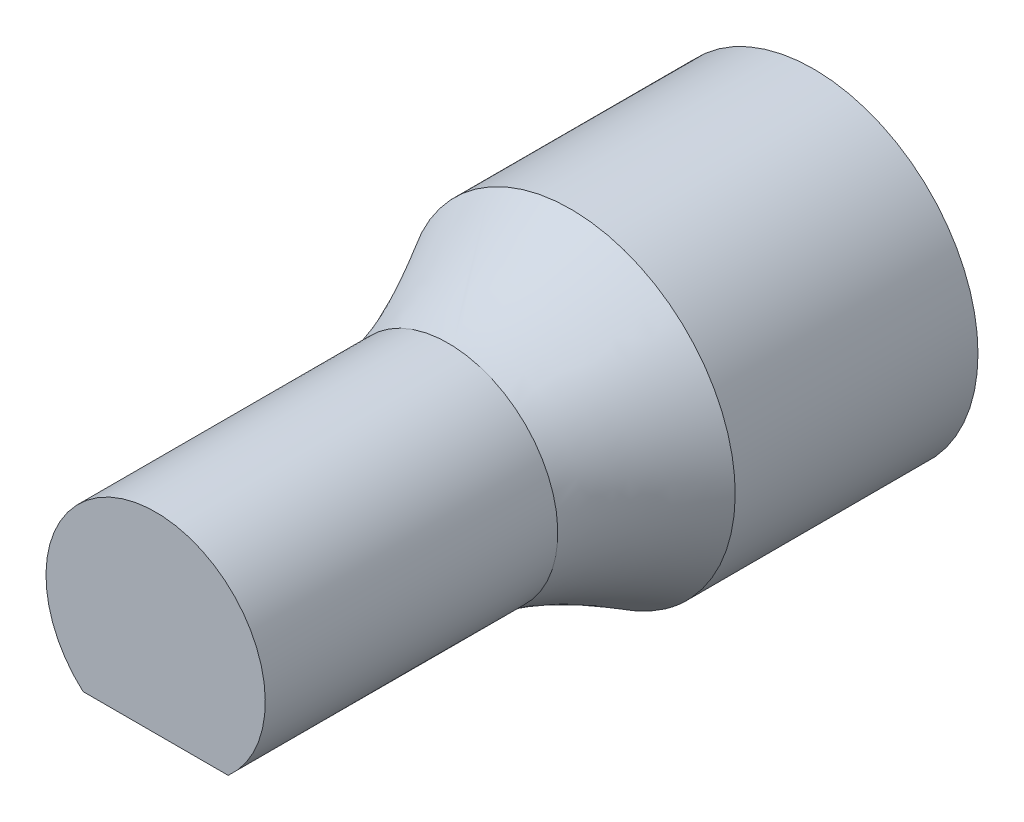
ISO-10303-21;
HEADER;
FILE_DESCRIPTION(('STEP AP214'),'2;1');
FILE_NAME('part.step','',(''),(''),'','','');
FILE_SCHEMA(('AUTOMOTIVE_DESIGN { 1 0 10303 214 1 1 1 1 }'));
ENDSEC;
DATA;
#1=APPLICATION_CONTEXT('core data for automotive mechanical design processes');
#2=APPLICATION_PROTOCOL_DEFINITION('international standard','automotive_design',2000,#1);
#3=PRODUCT_CONTEXT('',#1,'mechanical');
#4=PRODUCT('Part','Part','',(#3));
#5=PRODUCT_RELATED_PRODUCT_CATEGORY('part','',(#4));
#6=PRODUCT_DEFINITION_FORMATION('','',#4);
#7=PRODUCT_DEFINITION_CONTEXT('part definition',#1,'design');
#8=PRODUCT_DEFINITION('design','',#6,#7);
#9=PRODUCT_DEFINITION_SHAPE('','',#8);
#10=(LENGTH_UNIT() NAMED_UNIT(*) SI_UNIT(.MILLI.,.METRE.));
#11=(NAMED_UNIT(*) PLANE_ANGLE_UNIT() SI_UNIT($,.RADIAN.));
#12=(NAMED_UNIT(*) SI_UNIT($,.STERADIAN.) SOLID_ANGLE_UNIT());
#13=UNCERTAINTY_MEASURE_WITH_UNIT(LENGTH_MEASURE(1.E-05),#10,'distance_accuracy_value','');
#14=(GEOMETRIC_REPRESENTATION_CONTEXT(3) GLOBAL_UNCERTAINTY_ASSIGNED_CONTEXT((#13)) GLOBAL_UNIT_ASSIGNED_CONTEXT((#10,
#11,#12)) REPRESENTATION_CONTEXT('',''));
#15=CARTESIAN_POINT('',(0.,0.,0.));
#16=DIRECTION('',(0.,0.,1.));
#17=DIRECTION('',(1.,0.,0.));
#18=AXIS2_PLACEMENT_3D('',#15,#16,#17);
#19=CARTESIAN_POINT('',(0.,-0.79,14.06));
#20=DIRECTION('',(0.,0.,-1.));
#21=DIRECTION('',(-1.,0.,0.));
#22=AXIS2_PLACEMENT_3D('',#19,#20,#21);
#23=CYLINDRICAL_SURFACE('',#22,5.555);
#24=CARTESIAN_POINT('',(0.,-0.79,14.06));
#25=DIRECTION('',(0.,0.,1.));
#26=DIRECTION('',(1.,0.,0.));
#27=AXIS2_PLACEMENT_3D('',#24,#25,#26);
#28=CIRCLE('',#27,5.555);
#29=CARTESIAN_POINT('',(3.88550189808215,-4.76,14.06));
#30=VERTEX_POINT('',#29);
#31=CARTESIAN_POINT('',(-3.88550189808215,-4.76,14.06));
#32=VERTEX_POINT('',#31);
#33=EDGE_CURVE('E86',#30,#32,#28,.T.);
#34=ORIENTED_EDGE('',*,*,#33,.T.);
#35=DIRECTION('',(0.,0.,-1.));
#36=VECTOR('',#35,1.);
#37=CARTESIAN_POINT('',(-3.88550189808215,-4.76,38.102));
#38=LINE('',#37,#36);
#39=CARTESIAN_POINT('',(-3.88550189808215,-4.76,0.));
#40=VERTEX_POINT('',#39);
#41=EDGE_CURVE('E67',#32,#40,#38,.T.);
#42=ORIENTED_EDGE('',*,*,#41,.T.);
#43=CARTESIAN_POINT('',(0.,-0.79,0.));
#44=DIRECTION('',(0.,0.,1.));
#45=DIRECTION('',(1.,0.,0.));
#46=AXIS2_PLACEMENT_3D('',#43,#44,#45);
#47=CIRCLE('',#46,5.555);
#48=CARTESIAN_POINT('',(3.88550189808215,-4.76,0.));
#49=VERTEX_POINT('',#48);
#50=EDGE_CURVE('E62',#49,#40,#47,.T.);
#51=ORIENTED_EDGE('',*,*,#50,.F.);
#52=DIRECTION('',(0.,0.,-1.));
#53=VECTOR('',#52,1.);
#54=CARTESIAN_POINT('',(3.88550189808215,-4.76,38.102));
#55=LINE('',#54,#53);
#56=EDGE_CURVE('E93',#30,#49,#55,.T.);
#57=ORIENTED_EDGE('',*,*,#56,.F.);
#58=EDGE_LOOP('',(#34,#42,#51,#57));
#59=FACE_BOUND('',#58,.T.);
#60=ADVANCED_FACE('F43',(#59),#23,.F.);
#61=CARTESIAN_POINT('',(0.,0.,14.06));
#62=DIRECTION('',(0.,0.,1.));
#63=DIRECTION('',(1.,0.,0.));
#64=AXIS2_PLACEMENT_3D('',#61,#62,#63);
#65=PLANE('',#64);
#66=DIRECTION('',(-1.,0.,0.));
#67=VECTOR('',#66,1.);
#68=CARTESIAN_POINT('',(0.,-4.76,14.06));
#69=LINE('',#68,#67);
#70=EDGE_CURVE('E89',#30,#32,#69,.T.);
#71=ORIENTED_EDGE('',*,*,#70,.T.);
#72=ORIENTED_EDGE('',*,*,#33,.F.);
#73=EDGE_LOOP('',(#71,#72));
#74=FACE_BOUND('',#73,.T.);
#75=ADVANCED_FACE('F87',(#74),#65,.F.);
#76=CARTESIAN_POINT('',(0.,0.,38.1));
#77=DIRECTION('',(0.,0.,-1.));
#78=DIRECTION('',(-1.,0.,0.));
#79=AXIS2_PLACEMENT_3D('',#76,#77,#78);
#80=CYLINDRICAL_SURFACE('',#79,6.35);
#81=CARTESIAN_POINT('',(0.,0.,21.16));
#82=DIRECTION('',(0.,0.,1.));
#83=DIRECTION('',(1.,0.,0.));
#84=AXIS2_PLACEMENT_3D('',#81,#82,#83);
#85=CIRCLE('',#84,6.35);
#86=CARTESIAN_POINT('',(0.279197551318442,6.34385913520609,21.16));
#87=VERTEX_POINT('',#86);
#88=EDGE_CURVE('E91',#87,#87,#85,.T.);
#89=ORIENTED_EDGE('',*,*,#88,.T.);
#90=EDGE_LOOP('',(#89));
#91=FACE_BOUND('',#90,.T.);
#92=DIRECTION('',(0.,0.,1.));
#93=VECTOR('',#92,1.);
#94=CARTESIAN_POINT('',(-4.20296324038172,-4.76,32.54));
#95=LINE('',#94,#93);
#96=CARTESIAN_POINT('',(-4.20296324038172,-4.76,32.54));
#97=VERTEX_POINT('',#96);
#98=CARTESIAN_POINT('',(-4.20296324038172,-4.76,38.100006));
#99=VERTEX_POINT('',#98);
#100=EDGE_CURVE('E208',#97,#99,#95,.T.);
#101=ORIENTED_EDGE('',*,*,#100,.T.);
#102=CARTESIAN_POINT('',(0.,0.,38.1));
#103=DIRECTION('',(0.,0.,1.));
#104=DIRECTION('',(1.,0.,0.));
#105=AXIS2_PLACEMENT_3D('',#102,#103,#104);
#106=CIRCLE('',#105,6.35);
#107=CARTESIAN_POINT('',(4.20296324038172,-4.76,38.1));
#108=VERTEX_POINT('',#107);
#109=EDGE_CURVE('E232',#108,#99,#106,.T.);
#110=ORIENTED_EDGE('',*,*,#109,.F.);
#111=DIRECTION('',(0.,0.,1.));
#112=VECTOR('',#111,1.);
#113=CARTESIAN_POINT('',(4.20296324038172,-4.76,32.54));
#114=LINE('',#113,#112);
#115=CARTESIAN_POINT('',(4.20296324038172,-4.76,32.54));
#116=VERTEX_POINT('',#115);
#117=EDGE_CURVE('E210',#116,#108,#114,.T.);
#118=ORIENTED_EDGE('',*,*,#117,.F.);
#119=CARTESIAN_POINT('',(0.,0.,32.54));
#120=DIRECTION('',(0.,0.,1.));
#121=DIRECTION('',(1.,0.,0.));
#122=AXIS2_PLACEMENT_3D('',#119,#120,#121);
#123=CIRCLE('',#122,6.35);
#124=EDGE_CURVE('E202',#97,#116,#123,.T.);
#125=ORIENTED_EDGE('',*,*,#124,.F.);
#126=EDGE_LOOP('',(#101,#110,#118,#125));
#127=FACE_BOUND('',#126,.T.);
#128=ADVANCED_FACE('F134',(#91,#127),#80,.T.);
#129=CARTESIAN_POINT('',(0.,0.,38.1));
#130=DIRECTION('',(0.,0.,1.));
#131=DIRECTION('',(1.,0.,0.));
#132=AXIS2_PLACEMENT_3D('',#129,#130,#131);
#133=PLANE('',#132);
#134=ORIENTED_EDGE('',*,*,#109,.T.);
#135=DIRECTION('',(1.,0.,0.));
#136=VECTOR('',#135,1.);
#137=CARTESIAN_POINT('',(0.,-4.76,38.1));
#138=LINE('',#137,#136);
#139=EDGE_CURVE('E12',#99,#108,#138,.T.);
#140=ORIENTED_EDGE('',*,*,#139,.T.);
#141=EDGE_LOOP('',(#134,#140));
#142=FACE_BOUND('',#141,.T.);
#143=ADVANCED_FACE('F143',(#142),#133,.T.);
#144=CARTESIAN_POINT('',(0.,0.,0.));
#145=DIRECTION('',(0.,0.,1.));
#146=DIRECTION('',(1.,0.,0.));
#147=AXIS2_PLACEMENT_3D('',#144,#145,#146);
#148=PLANE('',#147);
#149=CARTESIAN_POINT('',(0.,0.,0.));
#150=DIRECTION('',(0.,0.,1.));
#151=DIRECTION('',(1.,0.,0.));
#152=AXIS2_PLACEMENT_3D('',#149,#150,#151);
#153=CIRCLE('',#152,9.525);
#154=CARTESIAN_POINT('',(9.525,0.,0.));
#155=VERTEX_POINT('',#154);
#156=EDGE_CURVE('E155',#155,#155,#153,.T.);
#157=ORIENTED_EDGE('',*,*,#156,.F.);
#158=EDGE_LOOP('',(#157));
#159=FACE_BOUND('',#158,.T.);
#160=ORIENTED_EDGE('',*,*,#50,.T.);
#161=DIRECTION('',(-1.,0.,0.));
#162=VECTOR('',#161,1.);
#163=CARTESIAN_POINT('',(0.,-4.76,0.));
#164=LINE('',#163,#162);
#165=EDGE_CURVE('E156',#49,#40,#164,.T.);
#166=ORIENTED_EDGE('',*,*,#165,.F.);
#167=EDGE_LOOP('',(#160,#166));
#168=FACE_BOUND('',#167,.T.);
#169=ADVANCED_FACE('F141',(#159,#168),#148,.F.);
#170=CARTESIAN_POINT('',(0.,0.,14.06));
#171=DIRECTION('',(0.,0.,-1.));
#172=DIRECTION('',(-1.,0.,0.));
#173=AXIS2_PLACEMENT_3D('',#170,#171,#172);
#174=CYLINDRICAL_SURFACE('',#173,9.525);
#175=CARTESIAN_POINT('',(0.,-9.525,7.54));
#176=CARTESIAN_POINT('',(0.0665646520037431,-9.52499907170145,7.53999717192607));
#177=CARTESIAN_POINT('',(0.133170905648445,-9.52429485853708,7.53439606066817));
#178=CARTESIAN_POINT('',(0.264530009211301,-9.52155335064731,7.51214053536461));
#179=CARTESIAN_POINT('',(0.329280849845303,-9.5195146637934,7.49547457816616));
#180=CARTESIAN_POINT('',(0.455008417360699,-9.51433387889246,7.45158802653012));
#181=CARTESIAN_POINT('',(0.515987651873185,-9.51119252345853,7.42437453424851));
#182=CARTESIAN_POINT('',(0.632502022652443,-9.50415578957354,7.36018092610919));
#183=CARTESIAN_POINT('',(0.688038091007486,-9.50026054056031,7.32320248642253));
#184=CARTESIAN_POINT('',(0.792406676952907,-9.49212697127573,7.24031123577508));
#185=CARTESIAN_POINT('',(0.84120494692922,-9.48788706067079,7.19435545525842));
#186=CARTESIAN_POINT('',(0.930417788482917,-9.47955485668132,7.09490628636782));
#187=CARTESIAN_POINT('',(0.970831932835929,-9.47546257082798,7.04141251411852));
#188=CARTESIAN_POINT('',(1.04225683375581,-9.46787329340602,6.9281833530743));
#189=CARTESIAN_POINT('',(1.07323551067544,-9.4643783500292,6.86842757934556));
#190=CARTESIAN_POINT('',(1.1247052340692,-9.4584004228715,6.74451079898244));
#191=CARTESIAN_POINT('',(1.14519667783775,-9.4559174007561,6.68034995933238));
#192=CARTESIAN_POINT('',(1.17500620795241,-9.45225962798759,6.54979972895473));
#193=CARTESIAN_POINT('',(1.18438211302209,-9.45107810971302,6.48342373333925));
#194=CARTESIAN_POINT('',(1.19187332796745,-9.450136403881,6.35003067533558));
#195=CARTESIAN_POINT('',(1.18998909021671,-9.45037615922421,6.28301363880904));
#196=CARTESIAN_POINT('',(1.17506096946319,-9.45224371835326,6.15064380683935));
#197=CARTESIAN_POINT('',(1.16208077520942,-9.45386360029008,6.08528370119249));
#198=CARTESIAN_POINT('',(1.12542857055956,-9.45829653544857,5.95767673148242));
#199=CARTESIAN_POINT('',(1.10175634374461,-9.46110961282181,5.89542993046436));
#200=CARTESIAN_POINT('',(1.04432358022543,-9.46762095589266,5.77561866426801));
#201=CARTESIAN_POINT('',(1.01053536538763,-9.47132164456707,5.71806760393962));
#202=CARTESIAN_POINT('',(0.933849550190272,-9.47918935918016,5.60942837052452));
#203=CARTESIAN_POINT('',(0.890951533604896,-9.48335640642261,5.55834049291015));
#204=CARTESIAN_POINT('',(0.796910859530198,-9.49172252818641,5.46370815226672));
#205=CARTESIAN_POINT('',(0.7457133055874,-9.49592162513353,5.42021822585762));
#206=CARTESIAN_POINT('',(0.636715888465115,-9.50385178207517,5.3424409359232));
#207=CARTESIAN_POINT('',(0.578916010089009,-9.50758284099238,5.30815359358015));
#208=CARTESIAN_POINT('',(0.458312624526359,-9.51415884469546,5.24975472774513));
#209=CARTESIAN_POINT('',(0.395507447460568,-9.51700349218751,5.22564661730889));
#210=CARTESIAN_POINT('',(0.266696949285937,-9.52148345761662,5.18833384275383));
#211=CARTESIAN_POINT('',(0.200691777989969,-9.5231188321096,5.17512866871741));
#212=CARTESIAN_POINT('',(0.0678264889648324,-9.5249886368126,5.16006729316944));
#213=CARTESIAN_POINT('',(0.000975012917946955,-9.5252323407042,5.15813596416415));
#214=CARTESIAN_POINT('',(-0.132098660203066,-9.52431638332426,5.16547884207427));
#215=CARTESIAN_POINT('',(-0.198320870633775,-9.52315675190681,5.17475281061192));
#216=CARTESIAN_POINT('',(-0.32803454383064,-9.51957020630124,5.20418061919775));
#217=CARTESIAN_POINT('',(-0.391534258151819,-9.51714746524507,5.22429863943638));
#218=CARTESIAN_POINT('',(-0.51425856889069,-9.51130594946059,5.27480623482391));
#219=CARTESIAN_POINT('',(-0.573483020203593,-9.50788714094501,5.30519615840816));
#220=CARTESIAN_POINT('',(-0.686311172020218,-9.50041153946152,5.37556668112851));
#221=CARTESIAN_POINT('',(-0.739884346150237,-9.49635155070484,5.41559587922059));
#222=CARTESIAN_POINT('',(-0.8395786262053,-9.48805775592256,5.50403991113463));
#223=CARTESIAN_POINT('',(-0.885699436509325,-9.48382394301005,5.55245507745415));
#224=CARTESIAN_POINT('',(-0.969446321520713,-9.47563106843556,5.65662763562662));
#225=CARTESIAN_POINT('',(-1.00702259779219,-9.47167370611486,5.71242521479362));
#226=CARTESIAN_POINT('',(-1.07226973749048,-9.46450973694477,5.82958368660234));
#227=CARTESIAN_POINT('',(-1.09994079931048,-9.46130311505912,5.89094446778691));
#228=CARTESIAN_POINT('',(-1.14451140309528,-9.45601525451816,6.01732682675089));
#229=CARTESIAN_POINT('',(-1.161439026368,-9.45393108416766,6.08233837334732));
#230=CARTESIAN_POINT('',(-1.18413266957875,-9.45111568721878,6.21430890357267));
#231=CARTESIAN_POINT('',(-1.18989920817153,-9.4503843977522,6.28126779656178));
#232=CARTESIAN_POINT('',(-1.19009748271758,-9.45035939069785,6.41473686882035));
#233=CARTESIAN_POINT('',(-1.18460745471799,-9.45105575057478,6.48124694356524));
#234=CARTESIAN_POINT('',(-1.16261410620535,-9.45378624695124,6.61239114394326));
#235=CARTESIAN_POINT('',(-1.14611078447389,-9.45582038359876,6.67702526936885));
#236=CARTESIAN_POINT('',(-1.10258376851857,-9.46099416880242,6.80257258060853));
#237=CARTESIAN_POINT('',(-1.07556383821178,-9.46413342179665,6.86348708866818));
#238=CARTESIAN_POINT('',(-1.01177830478418,-9.47116437846166,6.97993006096783));
#239=CARTESIAN_POINT('',(-0.975012580056269,-9.47505609152141,7.03545845798864));
#240=CARTESIAN_POINT('',(-0.892488846510419,-9.48318587427232,7.13995288077489));
#241=CARTESIAN_POINT('',(-0.846672532268641,-9.48742607972733,7.18887269729));
#242=CARTESIAN_POINT('',(-0.747469729091237,-9.49575622588527,7.27835972956708));
#243=CARTESIAN_POINT('',(-0.694081457725055,-9.49984613092141,7.31892497314251));
#244=CARTESIAN_POINT('',(-0.581017694542081,-9.50743200612474,7.39068250783797));
#245=CARTESIAN_POINT('',(-0.521319088388247,-9.51092566093731,7.42183860613924));
#246=CARTESIAN_POINT('',(-0.397526902560449,-9.51690191028703,7.47363903223344));
#247=CARTESIAN_POINT('',(-0.333438185297214,-9.51938560294232,7.4942947830592));
#248=CARTESIAN_POINT('',(-0.224181596016581,-9.52246331056611,7.51956339902692));
#249=CARTESIAN_POINT('',(-0.179702687213666,-9.52340993512496,7.5272161109897));
#250=CARTESIAN_POINT('',(-0.0901555449611941,-9.52467859193208,7.53743535054286));
#251=CARTESIAN_POINT('',(-0.0450873158535709,-9.52500062877952,7.54000191558521));
#252=CARTESIAN_POINT('',(0.,-9.525,7.54));
#253=B_SPLINE_CURVE_WITH_KNOTS('',3,(#175,#176,#177,#178,#179,#180,#181,#182,#183,#184,#185,
#186,#187,#188,#189,#190,#191,#192,#193,#194,#195,#196,#197,#198,#199,#200,#201,#202,#203,#204,
#205,#206,#207,#208,#209,#210,#211,#212,#213,#214,#215,#216,#217,#218,#219,#220,#221,#222,#223,
#224,#225,#226,#227,#228,#229,#230,#231,#232,#233,#234,#235,#236,#237,#238,#239,#240,#241,#242,
#243,#244,#245,#246,#247,#248,#249,#250,#251,#252),.UNSPECIFIED.,.T.,.F.,(4,2,2,2,2,2,2,2,2,2,2,
2,2,2,2,2,2,2,2,2,2,2,2,2,2,2,2,2,2,2,2,2,2,2,2,2,2,2,4),(0.,0.199529266287023,
0.399267014778791,0.598870503365468,0.798439751894953,0.998988728802717,1.199547922444,
1.40078157549877,1.60200760452837,1.80218227602547,2.0023489056066,2.20137427117681,
2.4004036654268,2.59998267510015,2.79957080547855,3.00053741906827,3.20150449523365,
3.40253890144869,3.60356390498639,3.80324775993076,4.0029273669426,4.20195140325147,
4.40098219137312,4.60103826680341,4.80110227612839,5.0023039881803,5.20350167010428,
5.40417126985321,5.60483154427725,5.80410190618667,6.00337229014164,6.20257142027768,
6.40177303611889,6.60230244941591,6.80287914571096,7.00421782289996,7.2053369981424,
7.34048838893393,7.47563878453141),.UNSPECIFIED.);
#254=CARTESIAN_POINT('',(0.,-9.525,7.54));
#255=VERTEX_POINT('',#254);
#256=EDGE_CURVE('E105',#255,#255,#253,.T.);
#257=ORIENTED_EDGE('',*,*,#256,.T.);
#258=EDGE_LOOP('',(#257));
#259=FACE_BOUND('',#258,.T.);
#260=CARTESIAN_POINT('',(0.,0.,14.06));
#261=DIRECTION('',(0.,0.,-1.));
#262=DIRECTION('',(-1.,0.,0.));
#263=AXIS2_PLACEMENT_3D('',#260,#261,#262);
#264=CIRCLE('',#263,9.525);
#265=CARTESIAN_POINT('',(-4.63060129883584,8.32365043783194,14.06));
#266=VERTEX_POINT('',#265);
#267=EDGE_CURVE('E54',#266,#266,#264,.F.);
#268=ORIENTED_EDGE('',*,*,#267,.F.);
#269=EDGE_LOOP('',(#268));
#270=FACE_BOUND('',#269,.T.);
#271=ORIENTED_EDGE('',*,*,#156,.T.);
#272=EDGE_LOOP('',(#271));
#273=FACE_BOUND('',#272,.T.);
#274=ADVANCED_FACE('F45',(#259,#270,#273),#174,.T.);
#275=CARTESIAN_POINT('',(-4.63060129883584,8.32365043783194,14.06));
#276=CARTESIAN_POINT('',(0.279197551318442,6.34385913520609,21.16));
#277=CARTESIAN_POINT('',(-21.2779021744997,-0.937552159839738,14.06));
#278=CARTESIAN_POINT('',(-12.4085207190937,6.90225423784298,21.16));
#279=CARTESIAN_POINT('',(-12.016699576828,-17.5848530355036,14.06));
#280=CARTESIAN_POINT('',(-12.9669158217306,-5.78546403256921,21.16));
#281=CARTESIAN_POINT('',(4.63060129883584,-8.32365043783194,14.06));
#282=CARTESIAN_POINT('',(-0.279197551318443,-6.34385913520609,21.16));
#283=CARTESIAN_POINT('',(21.2779021744997,0.937552159839736,14.06));
#284=CARTESIAN_POINT('',(12.4085207190937,-6.90225423784298,21.16));
#285=CARTESIAN_POINT('',(12.016699576828,17.5848530355036,14.06));
#286=CARTESIAN_POINT('',(12.9669158217306,5.78546403256921,21.16));
#287=CARTESIAN_POINT('',(-4.63060129883584,8.32365043783194,14.06));
#288=CARTESIAN_POINT('',(0.279197551318442,6.34385913520609,21.16));
#289=(BOUNDED_SURFACE() B_SPLINE_SURFACE(3,1,((#275,#276),(#277,#278),(#279,#280),(#281,#282),
(#283,#284),(#285,#286),(#287,#288)),.UNSPECIFIED.,.T.,.F.,.F.) B_SPLINE_SURFACE_WITH_KNOTS((4,
3,4),(2,2),(0.,0.5,1.),(0.,1.),
.UNSPECIFIED.) GEOMETRIC_REPRESENTATION_ITEM() RATIONAL_B_SPLINE_SURFACE(((1.,1.),
(0.333333333333333,0.333333333333333),(0.333333333333333,0.333333333333333),(1.,1.),
(0.333333333333333,0.333333333333333),(0.333333333333333,0.333333333333333),(1.,1.))) REPRESENTATION_ITEM('') SURFACE());
#290=CARTESIAN_POINT('',(-4.63060129883584,8.32365043783194,14.06));
#291=CARTESIAN_POINT('',(-4.5794575608134,8.30302761176292,14.1339583333333));
#292=CARTESIAN_POINT('',(-4.52831382279096,8.2824047856939,14.2079166666667));
#293=CARTESIAN_POINT('',(-4.42602634674608,8.24115913355586,14.3558333333333));
#294=CARTESIAN_POINT('',(-4.37488260872364,8.22053630748684,14.4297916666667));
#295=CARTESIAN_POINT('',(-4.27259513267876,8.1792906553488,14.5777083333333));
#296=CARTESIAN_POINT('',(-4.22145139465632,8.15866782927979,14.6516666666667));
#297=CARTESIAN_POINT('',(-4.11916391861143,8.11742217714175,14.7995833333333));
#298=CARTESIAN_POINT('',(-4.06802018058899,8.09679935107273,14.8735416666667));
#299=CARTESIAN_POINT('',(-3.96573270454411,8.05555369893469,15.0214583333333));
#300=CARTESIAN_POINT('',(-3.91458896652167,8.03493087286567,15.0954166666667));
#301=CARTESIAN_POINT('',(-3.81230149047679,7.99368522072763,15.2433333333333));
#302=CARTESIAN_POINT('',(-3.76115775245435,7.97306239465861,15.3172916666667));
#303=CARTESIAN_POINT('',(-3.65887027640947,7.93181674252057,15.4652083333333));
#304=CARTESIAN_POINT('',(-3.60772653838703,7.91119391645156,15.5391666666667));
#305=CARTESIAN_POINT('',(-3.50543906234215,7.86994826431352,15.6870833333333));
#306=CARTESIAN_POINT('',(-3.45429532431971,7.8493254382445,15.7610416666667));
#307=CARTESIAN_POINT('',(-3.35200784827483,7.80807978610646,15.9089583333333));
#308=CARTESIAN_POINT('',(-3.30086411025239,7.78745696003744,15.9829166666667));
#309=CARTESIAN_POINT('',(-3.19857663420751,7.7462113078994,16.1308333333333));
#310=CARTESIAN_POINT('',(-3.14743289618507,7.72558848183038,16.2047916666667));
#311=CARTESIAN_POINT('',(-3.04514542014019,7.68434282969234,16.3527083333333));
#312=CARTESIAN_POINT('',(-2.99400168211775,7.66372000362332,16.4266666666667));
#313=CARTESIAN_POINT('',(-2.89171420607286,7.62247435148528,16.5745833333333));
#314=CARTESIAN_POINT('',(-2.84057046805042,7.60185152541627,16.6485416666667));
#315=CARTESIAN_POINT('',(-2.73828299200554,7.56060587327823,16.7964583333333));
#316=CARTESIAN_POINT('',(-2.6871392539831,7.53998304720921,16.8704166666667));
#317=CARTESIAN_POINT('',(-2.58485177793822,7.49873739507117,17.0183333333333));
#318=CARTESIAN_POINT('',(-2.53370803991578,7.47811456900215,17.0922916666667));
#319=CARTESIAN_POINT('',(-2.4314205638709,7.43686891686411,17.2402083333333));
#320=CARTESIAN_POINT('',(-2.38027682584846,7.41624609079509,17.3141666666667));
#321=CARTESIAN_POINT('',(-2.27798934980358,7.37500043865705,17.4620833333333));
#322=CARTESIAN_POINT('',(-2.22684561178114,7.35437761258803,17.5360416666667));
#323=CARTESIAN_POINT('',(-2.12455813573626,7.31313196045,17.6839583333333));
#324=CARTESIAN_POINT('',(-2.07341439771382,7.29250913438098,17.7579166666667));
#325=CARTESIAN_POINT('',(-1.97112692166894,7.25126348224294,17.9058333333333));
#326=CARTESIAN_POINT('',(-1.9199831836465,7.23064065617392,17.9797916666667));
#327=CARTESIAN_POINT('',(-1.81769570760162,7.18939500403588,18.1277083333333));
#328=CARTESIAN_POINT('',(-1.76655196957918,7.16877217796686,18.2016666666667));
#329=CARTESIAN_POINT('',(-1.66426449353429,7.12752652582882,18.3495833333333));
#330=CARTESIAN_POINT('',(-1.61312075551185,7.1069036997598,18.4235416666667));
#331=CARTESIAN_POINT('',(-1.51083327946697,7.06565804762177,18.5714583333333));
#332=CARTESIAN_POINT('',(-1.45968954144453,7.04503522155275,18.6454166666667));
#333=CARTESIAN_POINT('',(-1.35740206539965,7.00378956941471,18.7933333333333));
#334=CARTESIAN_POINT('',(-1.30625832737721,6.98316674334569,18.8672916666667));
#335=CARTESIAN_POINT('',(-1.20397085133233,6.94192109120765,19.0152083333333));
#336=CARTESIAN_POINT('',(-1.15282711330989,6.92129826513863,19.0891666666667));
#337=CARTESIAN_POINT('',(-1.05053963726501,6.88005261300059,19.2370833333333));
#338=CARTESIAN_POINT('',(-0.999395899242569,6.85942978693157,19.3110416666667));
#339=CARTESIAN_POINT('',(-0.897108423197688,6.81818413479353,19.4589583333333));
#340=CARTESIAN_POINT('',(-0.845964685175247,6.79756130872451,19.5329166666667));
#341=CARTESIAN_POINT('',(-0.743677209130367,6.75631565658648,19.6808333333333));
#342=CARTESIAN_POINT('',(-0.692533471107926,6.73569283051746,19.7547916666667));
#343=CARTESIAN_POINT('',(-0.590245995063045,6.69444717837942,19.9027083333333));
#344=CARTESIAN_POINT('',(-0.539102257040605,6.6738243523104,19.9766666666667));
#345=CARTESIAN_POINT('',(-0.436814780995724,6.63257870017236,20.1245833333333));
#346=CARTESIAN_POINT('',(-0.385671042973283,6.61195587410334,20.1985416666667));
#347=CARTESIAN_POINT('',(-0.283383566928402,6.5707102219653,20.3464583333333));
#348=CARTESIAN_POINT('',(-0.232239828905962,6.55008739589628,20.4204166666667));
#349=CARTESIAN_POINT('',(-0.129952352861082,6.50884174375824,20.5683333333333));
#350=CARTESIAN_POINT('',(-0.0788086148386411,6.48821891768923,20.6422916666667));
#351=CARTESIAN_POINT('',(0.0234788612062401,6.44697326555119,20.7902083333333));
#352=CARTESIAN_POINT('',(0.0746225992286804,6.42635043948217,20.8641666666667));
#353=CARTESIAN_POINT('',(0.176910075273561,6.38510478734413,21.0120833333333));
#354=CARTESIAN_POINT('',(0.228053813296001,6.36448196127511,21.0860416666667));
#355=CARTESIAN_POINT('',(0.279197551318442,6.34385913520609,21.16));
#356=B_SPLINE_CURVE_WITH_KNOTS('',3,(#290,#291,#292,#293,#294,#295,#296,#297,#298,#299,#300,
#301,#302,#303,#304,#305,#306,#307,#308,#309,#310,#311,#312,#313,#314,#315,#316,#317,#318,#319,
#320,#321,#322,#323,#324,#325,#326,#327,#328,#329,#330,#331,#332,#333,#334,#335,#336,#337,#338,
#339,#340,#341,#342,#343,#344,#345,#346,#347,#348,#349,#350,#351,#352,#353,#354,#355),
.UNSPECIFIED.,.F.,.F.,(4,2,2,2,2,2,2,2,2,2,2,2,2,2,2,2,2,2,2,2,2,2,2,2,2,2,2,2,2,2,2,2,4),(0.,
0.276762283685529,0.55352456737106,0.830286851056589,1.10704913474212,1.38381141842765,
1.66057370211318,1.9373359857987,2.21409826948423,2.49086055316976,2.76762283685529,
3.04438512054082,3.32114740422635,3.59790968791188,3.87467197159741,4.15143425528294,
4.42819653896847,4.704958822654,4.98172110633952,5.25848339002505,5.53524567371058,
5.81200795739611,6.08877024108164,6.36553252476717,6.6422948084527,6.91905709213823,
7.19581937582376,7.47258165950929,7.74934394319481,8.02610622688035,8.30286851056588,
8.57963079425141,8.85639307793694),.UNSPECIFIED.);
#357=EDGE_CURVE('BSEAM137',#266,#87,#356,.T.);
#358=ORIENTED_EDGE('',*,*,#267,.T.);
#359=ORIENTED_EDGE('',*,*,#88,.F.);
#360=ORIENTED_EDGE('',*,*,#357,.T.);
#361=ORIENTED_EDGE('',*,*,#357,.F.);
#362=EDGE_LOOP('',(#358,#360,#359,#361));
#363=FACE_BOUND('',#362,.T.);
#364=ADVANCED_FACE('F137',(#363),#289,.T.);
#365=CARTESIAN_POINT('',(0.,-4.76,32.54));
#366=DIRECTION('',(0.,-1.,0.));
#367=DIRECTION('',(0.,0.,-1.));
#368=AXIS2_PLACEMENT_3D('',#365,#366,#367);
#369=PLANE('',#368);
#370=ORIENTED_EDGE('',*,*,#100,.F.);
#371=DIRECTION('',(1.,0.,0.));
#372=VECTOR('',#371,1.);
#373=CARTESIAN_POINT('',(0.,-4.76,32.54));
#374=LINE('',#373,#372);
#375=EDGE_CURVE('E200',#97,#116,#374,.T.);
#376=ORIENTED_EDGE('',*,*,#375,.T.);
#377=ORIENTED_EDGE('',*,*,#117,.T.);
#378=ORIENTED_EDGE('',*,*,#139,.F.);
#379=EDGE_LOOP('',(#370,#376,#377,#378));
#380=FACE_BOUND('',#379,.T.);
#381=ADVANCED_FACE('F188',(#380),#369,.T.);
#382=CARTESIAN_POINT('',(0.,0.,32.54));
#383=DIRECTION('',(0.,0.,1.));
#384=DIRECTION('',(1.,0.,0.));
#385=AXIS2_PLACEMENT_3D('',#382,#383,#384);
#386=PLANE('',#385);
#387=ORIENTED_EDGE('',*,*,#375,.F.);
#388=ORIENTED_EDGE('',*,*,#124,.T.);
#389=EDGE_LOOP('',(#387,#388));
#390=FACE_BOUND('',#389,.T.);
#391=ADVANCED_FACE('F190',(#390),#386,.T.);
#392=CARTESIAN_POINT('',(0.,-10.,6.35));
#393=DIRECTION('',(0.,1.,0.));
#394=DIRECTION('',(0.,0.,1.));
#395=AXIS2_PLACEMENT_3D('',#392,#393,#394);
#396=CYLINDRICAL_SURFACE('',#395,1.19);
#397=CARTESIAN_POINT('',(0.,-6.345,7.54));
#398=CARTESIAN_POINT('',(-0.0660342800705413,-6.3449987785693,7.53999769901845));
#399=CARTESIAN_POINT('',(-0.132096675101162,-6.34381054522923,7.53448497758751));
#400=CARTESIAN_POINT('',(-0.262347256952576,-6.33918517658702,7.51260129951598));
#401=CARTESIAN_POINT('',(-0.326534031175286,-6.33574638970602,7.49622236853748));
#402=CARTESIAN_POINT('',(-0.4511319497855,-6.32700307161996,7.45314101424384));
#403=CARTESIAN_POINT('',(-0.511546884142301,-6.32170044993285,7.42644915386445));
#404=CARTESIAN_POINT('',(-0.6270382694104,-6.30980278935291,7.36353262788096));
#405=CARTESIAN_POINT('',(-0.682114902544965,-6.30320779459855,7.3273082878256));
#406=CARTESIAN_POINT('',(-0.786218588873049,-6.2893349355929,7.24576340724437));
#407=CARTESIAN_POINT('',(-0.835151476315312,-6.28204889094645,7.20032403161075));
#408=CARTESIAN_POINT('',(-0.92476242152041,-6.26767321469706,7.10189414089));
#409=CARTESIAN_POINT('',(-0.965439766850931,-6.26058360009109,7.04890297477366));
#410=CARTESIAN_POINT('',(-1.03779677708058,-6.24732304298439,6.93618216810648));
#411=CARTESIAN_POINT('',(-1.06937687527162,-6.24116259388904,6.87638726987851));
#412=CARTESIAN_POINT('',(-1.12200448105653,-6.23057499737934,6.75218569518462));
#413=CARTESIAN_POINT('',(-1.14305319302135,-6.22614765177962,6.68777954702535));
#414=CARTESIAN_POINT('',(-1.17371068307904,-6.21961072599422,6.5572031738119));
#415=CARTESIAN_POINT('',(-1.18348581582231,-6.21746747825362,6.49107372759205));
#416=CARTESIAN_POINT('',(-1.1918357922015,-6.21564024605401,6.35808142217584));
#417=CARTESIAN_POINT('',(-1.19041195454324,-6.21595597204488,6.29121865025623));
#418=CARTESIAN_POINT('',(-1.17653843553382,-6.21898050657689,6.15988948366246));
#419=CARTESIAN_POINT('',(-1.16428136673547,-6.22164750787246,6.09540163337342));
#420=CARTESIAN_POINT('',(-1.12939419578288,-6.22900805753563,5.96941932573757));
#421=CARTESIAN_POINT('',(-1.10676353300549,-6.23370171542963,5.90792503037102));
#422=CARTESIAN_POINT('',(-1.05159297376499,-6.24462830217796,5.78913058067977));
#423=CARTESIAN_POINT('',(-1.018978450629,-6.25087275408801,5.7318661884464));
#424=CARTESIAN_POINT('',(-0.944818494318867,-6.2641901885736,5.62355151235318));
#425=CARTESIAN_POINT('',(-0.903271890871408,-6.2712632796614,5.57250204414126));
#426=CARTESIAN_POINT('',(-0.811404635046038,-6.28562084639312,5.47695676249435));
#427=CARTESIAN_POINT('',(-0.760920044060924,-6.29290666558294,5.43261862903321));
#428=CARTESIAN_POINT('',(-0.653150152505892,-6.30673513804077,5.35301320387277));
#429=CARTESIAN_POINT('',(-0.595864738317044,-6.31327777888919,5.3177460637505));
#430=CARTESIAN_POINT('',(-0.475931166127915,-6.32490261099682,5.25724721779043));
#431=CARTESIAN_POINT('',(-0.41327261583619,-6.32998188530954,5.23203551768028));
#432=CARTESIAN_POINT('',(-0.284475655442309,-6.33808590633392,5.19254202696314));
#433=CARTESIAN_POINT('',(-0.218337731666589,-6.34111093935764,5.17825871316556));
#434=CARTESIAN_POINT('',(-0.0858125781112801,-6.34472510386028,5.16125527111099));
#435=CARTESIAN_POINT('',(-0.0194541982128973,-6.34535962434883,5.15831965409863));
#436=CARTESIAN_POINT('',(0.112804780965925,-6.34424818460541,5.16351179241998));
#437=CARTESIAN_POINT('',(0.178705409686591,-6.34250237891574,5.17163882951262));
#438=CARTESIAN_POINT('',(0.307468893186604,-6.33685503192889,5.19854679900843));
#439=CARTESIAN_POINT('',(0.370356326067019,-6.332976248189,5.21721531581724));
#440=CARTESIAN_POINT('',(0.492107494023811,-6.32349684392529,5.26455201847898));
#441=CARTESIAN_POINT('',(0.550970895606491,-6.31789608090248,5.29322103192965));
#442=CARTESIAN_POINT('',(0.663898555914964,-6.30548170496591,5.36019815432461));
#443=CARTESIAN_POINT('',(0.717885511292984,-6.29865244354204,5.39863363738522));
#444=CARTESIAN_POINT('',(0.818720721554915,-6.28457168793053,5.48388423466184));
#445=CARTESIAN_POINT('',(0.865568088364432,-6.27732014137077,5.53070038975489));
#446=CARTESIAN_POINT('',(0.951641255105382,-6.26305626366774,5.63237035741972));
#447=CARTESIAN_POINT('',(0.990718144125873,-6.25605040282067,5.68735131005961));
#448=CARTESIAN_POINT('',(1.05908385859741,-6.24321751004059,5.80322248314124));
#449=CARTESIAN_POINT('',(1.08837310120201,-6.23739042787173,5.8641124515955));
#450=CARTESIAN_POINT('',(1.13613854198992,-6.2276289989537,5.98975038474738));
#451=CARTESIAN_POINT('',(1.15467454741873,-6.22368420552184,6.05447476035507));
#452=CARTESIAN_POINT('',(1.1805842337897,-6.21811428456523,6.18621442412922));
#453=CARTESIAN_POINT('',(1.18795961639902,-6.21648880341564,6.25322936145863));
#454=CARTESIAN_POINT('',(1.19126858612438,-6.21576318395032,6.38614805324596));
#455=CARTESIAN_POINT('',(1.1874380666431,-6.2166109800752,6.45204576143649));
#456=CARTESIAN_POINT('',(1.16896965273803,-6.22061899224897,6.58223355297953));
#457=CARTESIAN_POINT('',(1.15433187507362,-6.22377918331522,6.64652365369255));
#458=CARTESIAN_POINT('',(1.11477630319893,-6.23203104414622,6.77149313823992));
#459=CARTESIAN_POINT('',(1.08989150243942,-6.23711651069478,6.83218340184699));
#460=CARTESIAN_POINT('',(1.03057712630001,-6.24864860682688,6.94856300446305));
#461=CARTESIAN_POINT('',(0.996146603630323,-6.25509537148656,7.00425184641892));
#462=CARTESIAN_POINT('',(0.917929949678159,-6.26878014688331,7.1102136173693));
#463=CARTESIAN_POINT('',(0.873975139020827,-6.27603109085658,7.16036038740451));
#464=CARTESIAN_POINT('',(0.778301102847117,-6.29041889166352,7.25264376342384));
#465=CARTESIAN_POINT('',(0.726580088506841,-6.2975557217927,7.29477851888466));
#466=CARTESIAN_POINT('',(0.616073545931477,-6.31101542781947,7.370337737456));
#467=CARTESIAN_POINT('',(0.557208757905837,-6.3173271796774,7.40364836761797));
#468=CARTESIAN_POINT('',(0.434594214369691,-6.32831455003557,7.45985039018209));
#469=CARTESIAN_POINT('',(0.370848687052075,-6.33299156559133,7.48275068437705));
#470=CARTESIAN_POINT('',(0.255849119939279,-6.33932944969952,7.51331214786463));
#471=CARTESIAN_POINT('',(0.20522572893532,-6.34144291750499,7.52330131365669));
#472=CARTESIAN_POINT('',(0.103073910812623,-6.34427864087216,7.5366460018891));
#473=CARTESIAN_POINT('',(0.0515455208614682,-6.3450009534333,7.54000179611699));
#474=CARTESIAN_POINT('',(0.,-6.345,7.54));
#475=B_SPLINE_CURVE_WITH_KNOTS('',3,(#397,#398,#399,#400,#401,#402,#403,#404,#405,#406,#407,
#408,#409,#410,#411,#412,#413,#414,#415,#416,#417,#418,#419,#420,#421,#422,#423,#424,#425,#426,
#427,#428,#429,#430,#431,#432,#433,#434,#435,#436,#437,#438,#439,#440,#441,#442,#443,#444,#445,
#446,#447,#448,#449,#450,#451,#452,#453,#454,#455,#456,#457,#458,#459,#460,#461,#462,#463,#464,
#465,#466,#467,#468,#469,#470,#471,#472,#473,#474),.UNSPECIFIED.,.T.,.F.,(4,2,2,2,2,2,2,2,2,2,2,
2,2,2,2,2,2,2,2,2,2,2,2,2,2,2,2,2,2,2,2,2,2,2,2,2,2,2,4),(0.,0.197914190240527,
0.395973783807957,0.593831051897984,0.791681563736709,0.992267449754002,1.19287063847021,
1.39559250468859,1.59829118230134,1.79795891320242,1.99760313309788,2.19376756274179,
2.38994259500686,2.58762134989339,2.78532602027766,2.9871264876386,3.18893032688262,
3.39113368430732,3.59330885363726,3.79162536537782,3.98992900206442,4.186156795083,
4.38240083091677,4.58134891648098,4.78032172850495,4.98280203927104,5.18527371914141,
5.38660822236875,5.58791202490385,5.78500891214147,5.98210367001646,6.17856872201266,
6.37505327761459,6.57535303544163,6.77569900016674,6.97851583362647,7.18115891234599,
7.3356545474013,7.49014385221277),.UNSPECIFIED.);
#476=CARTESIAN_POINT('',(0.,-6.345,7.54));
#477=VERTEX_POINT('',#476);
#478=EDGE_CURVE('E101',#477,#477,#475,.T.);
#479=ORIENTED_EDGE('',*,*,#478,.F.);
#480=EDGE_LOOP('',(#479));
#481=FACE_BOUND('',#480,.T.);
#482=ORIENTED_EDGE('',*,*,#256,.F.);
#483=EDGE_LOOP('',(#482));
#484=FACE_BOUND('',#483,.T.);
#485=ADVANCED_FACE('F118',(#481,#484),#396,.F.);
#486=CARTESIAN_POINT('',(0.,-0.79,38.102));
#487=DIRECTION('',(0.,0.,-1.));
#488=DIRECTION('',(-1.,0.,0.));
#489=AXIS2_PLACEMENT_3D('',#486,#487,#488);
#490=CYLINDRICAL_SURFACE('',#489,5.555);
#491=ORIENTED_EDGE('',*,*,#478,.T.);
#492=EDGE_LOOP('',(#491));
#493=FACE_BOUND('',#492,.T.);
#494=ADVANCED_FACE('F122',(#493),#490,.T.);
#495=CARTESIAN_POINT('',(0.,-4.76,38.102));
#496=DIRECTION('',(0.,-1.,0.));
#497=DIRECTION('',(0.,0.,-1.));
#498=AXIS2_PLACEMENT_3D('',#495,#496,#497);
#499=PLANE('',#498);
#500=ORIENTED_EDGE('',*,*,#70,.F.);
#501=ORIENTED_EDGE('',*,*,#56,.T.);
#502=ORIENTED_EDGE('',*,*,#165,.T.);
#503=ORIENTED_EDGE('',*,*,#41,.F.);
#504=EDGE_LOOP('',(#500,#501,#502,#503));
#505=FACE_BOUND('',#504,.T.);
#506=ADVANCED_FACE('F99',(#505),#499,.F.);
#507=CLOSED_SHELL('',(#60,#75,#128,#143,#169,#274,#364,#381,#391,#485,#494,#506));
#508=MANIFOLD_SOLID_BREP('B2',#507);
#509=ADVANCED_BREP_SHAPE_REPRESENTATION('',(#18,#508),#14);
#510=SHAPE_DEFINITION_REPRESENTATION(#9,#509);
ENDSEC;
END-ISO-10303-21;
